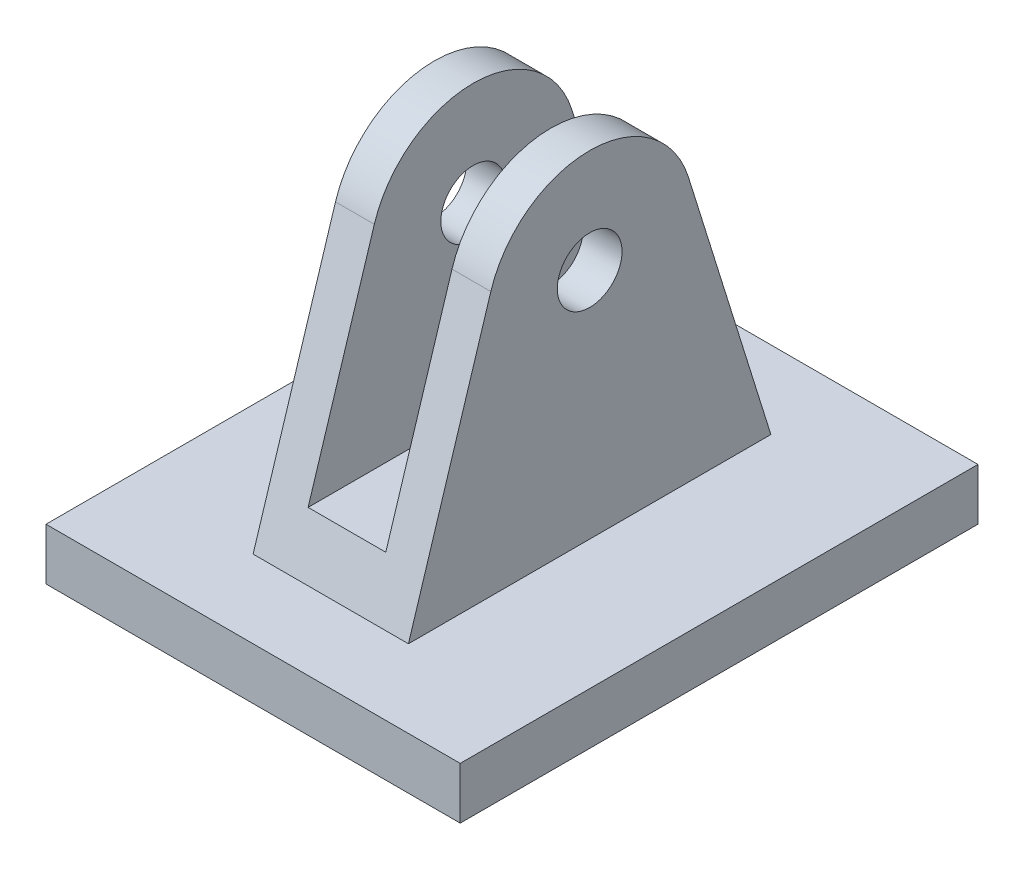
ISO-10303-21;
HEADER;
FILE_DESCRIPTION(('STEP AP214'),'2;1');
FILE_NAME('part.step','',(''),(''),'','','');
FILE_SCHEMA(('AUTOMOTIVE_DESIGN { 1 0 10303 214 1 1 1 1 }'));
ENDSEC;
DATA;
#1=APPLICATION_CONTEXT('core data for automotive mechanical design processes');
#2=APPLICATION_PROTOCOL_DEFINITION('international standard','automotive_design',2000,#1);
#3=PRODUCT_CONTEXT('',#1,'mechanical');
#4=PRODUCT('Part','Part','',(#3));
#5=PRODUCT_RELATED_PRODUCT_CATEGORY('part','',(#4));
#6=PRODUCT_DEFINITION_FORMATION('','',#4);
#7=PRODUCT_DEFINITION_CONTEXT('part definition',#1,'design');
#8=PRODUCT_DEFINITION('design','',#6,#7);
#9=PRODUCT_DEFINITION_SHAPE('','',#8);
#10=(LENGTH_UNIT() NAMED_UNIT(*) SI_UNIT(.MILLI.,.METRE.));
#11=(NAMED_UNIT(*) PLANE_ANGLE_UNIT() SI_UNIT($,.RADIAN.));
#12=(NAMED_UNIT(*) SI_UNIT($,.STERADIAN.) SOLID_ANGLE_UNIT());
#13=UNCERTAINTY_MEASURE_WITH_UNIT(LENGTH_MEASURE(1.E-05),#10,'distance_accuracy_value','');
#14=(GEOMETRIC_REPRESENTATION_CONTEXT(3) GLOBAL_UNCERTAINTY_ASSIGNED_CONTEXT((#13)) GLOBAL_UNIT_ASSIGNED_CONTEXT((#10,
#11,#12)) REPRESENTATION_CONTEXT('',''));
#15=CARTESIAN_POINT('',(0.,0.,0.));
#16=DIRECTION('',(0.,0.,1.));
#17=DIRECTION('',(1.,0.,0.));
#18=AXIS2_PLACEMENT_3D('',#15,#16,#17);
#19=CARTESIAN_POINT('',(15.,55.,0.));
#20=DIRECTION('',(-1.,0.,0.));
#21=DIRECTION('',(0.,0.,1.));
#22=AXIS2_PLACEMENT_3D('',#19,#20,#21);
#23=CYLINDRICAL_SURFACE('',#22,20.);
#24=DIRECTION('',(-1.,0.,0.));
#25=VECTOR('',#24,1.);
#26=CARTESIAN_POINT('',(15.,60.9599304252645,19.0913391181972));
#27=LINE('',#26,#25);
#28=CARTESIAN_POINT('',(-7.5,60.9599304252645,19.0913391181972));
#29=VERTEX_POINT('',#28);
#30=CARTESIAN_POINT('',(-15.,60.9599304252645,19.0913391181972));
#31=VERTEX_POINT('',#30);
#32=EDGE_CURVE('E202',#29,#31,#27,.T.);
#33=ORIENTED_EDGE('',*,*,#32,.F.);
#34=CARTESIAN_POINT('',(-7.5,55.,0.));
#35=DIRECTION('',(-1.,0.,0.));
#36=DIRECTION('',(0.,0.,1.));
#37=AXIS2_PLACEMENT_3D('',#34,#35,#36);
#38=CIRCLE('',#37,20.);
#39=CARTESIAN_POINT('',(-7.5,60.9599304252645,-19.0913391181972));
#40=VERTEX_POINT('',#39);
#41=EDGE_CURVE('E165',#29,#40,#38,.T.);
#42=ORIENTED_EDGE('',*,*,#41,.T.);
#43=DIRECTION('',(-1.,0.,0.));
#44=VECTOR('',#43,1.);
#45=CARTESIAN_POINT('',(15.,60.9599304252645,-19.0913391181972));
#46=LINE('',#45,#44);
#47=CARTESIAN_POINT('',(-15.,60.9599304252645,-19.0913391181972));
#48=VERTEX_POINT('',#47);
#49=EDGE_CURVE('E207',#40,#48,#46,.T.);
#50=ORIENTED_EDGE('',*,*,#49,.T.);
#51=CARTESIAN_POINT('',(-15.,55.,0.));
#52=DIRECTION('',(1.,0.,0.));
#53=DIRECTION('',(0.,0.,1.));
#54=AXIS2_PLACEMENT_3D('',#51,#52,#53);
#55=CIRCLE('',#54,20.);
#56=EDGE_CURVE('E193',#48,#31,#55,.T.);
#57=ORIENTED_EDGE('',*,*,#56,.T.);
#58=EDGE_LOOP('',(#33,#42,#50,#57));
#59=FACE_BOUND('',#58,.T.);
#60=ADVANCED_FACE('F43',(#59),#23,.T.);
#61=CARTESIAN_POINT('',(15.,55.,0.));
#62=DIRECTION('',(-1.,0.,0.));
#63=DIRECTION('',(0.,0.,1.));
#64=AXIS2_PLACEMENT_3D('',#61,#62,#63);
#65=CYLINDRICAL_SURFACE('',#64,6.25);
#66=CARTESIAN_POINT('',(-7.5,55.,0.));
#67=DIRECTION('',(-1.,0.,0.));
#68=DIRECTION('',(0.,0.,1.));
#69=AXIS2_PLACEMENT_3D('',#66,#67,#68);
#70=CIRCLE('',#69,6.25);
#71=CARTESIAN_POINT('',(-7.5,55.,6.25000000000001));
#72=VERTEX_POINT('',#71);
#73=EDGE_CURVE('E146',#72,#72,#70,.T.);
#74=ORIENTED_EDGE('',*,*,#73,.F.);
#75=EDGE_LOOP('',(#74));
#76=FACE_BOUND('',#75,.T.);
#77=CARTESIAN_POINT('',(-15.,55.,0.));
#78=DIRECTION('',(1.,0.,0.));
#79=DIRECTION('',(0.,0.,-1.));
#80=AXIS2_PLACEMENT_3D('',#77,#78,#79);
#81=CIRCLE('',#80,6.25);
#82=CARTESIAN_POINT('',(-15.,55.,-6.24999999999999));
#83=VERTEX_POINT('',#82);
#84=EDGE_CURVE('E158',#83,#83,#81,.T.);
#85=ORIENTED_EDGE('',*,*,#84,.F.);
#86=EDGE_LOOP('',(#85));
#87=FACE_BOUND('',#86,.T.);
#88=ADVANCED_FACE('F311',(#76,#87),#65,.F.);
#89=CARTESIAN_POINT('',(0.,10.,0.));
#90=DIRECTION('',(0.,1.,0.));
#91=DIRECTION('',(0.,0.,1.));
#92=AXIS2_PLACEMENT_3D('',#89,#90,#91);
#93=PLANE('',#92);
#94=DIRECTION('',(0.,0.,1.));
#95=VECTOR('',#94,1.);
#96=CARTESIAN_POINT('',(-40.,10.,-50.));
#97=LINE('',#96,#95);
#98=CARTESIAN_POINT('',(-40.,10.,-50.));
#99=VERTEX_POINT('',#98);
#100=CARTESIAN_POINT('',(-40.,10.,50.));
#101=VERTEX_POINT('',#100);
#102=EDGE_CURVE('E216',#99,#101,#97,.T.);
#103=ORIENTED_EDGE('',*,*,#102,.T.);
#104=DIRECTION('',(1.,0.,0.));
#105=VECTOR('',#104,1.);
#106=CARTESIAN_POINT('',(-40.,10.,50.));
#107=LINE('',#106,#105);
#108=CARTESIAN_POINT('',(40.,10.,50.));
#109=VERTEX_POINT('',#108);
#110=EDGE_CURVE('E220',#101,#109,#107,.T.);
#111=ORIENTED_EDGE('',*,*,#110,.T.);
#112=DIRECTION('',(0.,0.,-1.));
#113=VECTOR('',#112,1.);
#114=CARTESIAN_POINT('',(40.,10.,-50.));
#115=LINE('',#114,#113);
#116=CARTESIAN_POINT('',(40.,10.,-50.));
#117=VERTEX_POINT('',#116);
#118=EDGE_CURVE('E224',#109,#117,#115,.T.);
#119=ORIENTED_EDGE('',*,*,#118,.T.);
#120=DIRECTION('',(-1.,0.,0.));
#121=VECTOR('',#120,1.);
#122=CARTESIAN_POINT('',(-40.,10.,-50.));
#123=LINE('',#122,#121);
#124=EDGE_CURVE('E227',#117,#99,#123,.T.);
#125=ORIENTED_EDGE('',*,*,#124,.T.);
#126=EDGE_LOOP('',(#103,#111,#119,#125));
#127=FACE_BOUND('',#126,.T.);
#128=DIRECTION('',(-1.,0.,0.));
#129=VECTOR('',#128,1.);
#130=CARTESIAN_POINT('',(15.,10.,35.));
#131=LINE('',#130,#129);
#132=CARTESIAN_POINT('',(15.,10.,35.));
#133=VERTEX_POINT('',#132);
#134=CARTESIAN_POINT('',(-15.,10.,35.));
#135=VERTEX_POINT('',#134);
#136=EDGE_CURVE('E186',#133,#135,#131,.T.);
#137=ORIENTED_EDGE('',*,*,#136,.T.);
#138=DIRECTION('',(0.,0.,-1.));
#139=VECTOR('',#138,1.);
#140=CARTESIAN_POINT('',(-15.,10.,35.));
#141=LINE('',#140,#139);
#142=CARTESIAN_POINT('',(-15.,10.,-35.));
#143=VERTEX_POINT('',#142);
#144=EDGE_CURVE('E67',#135,#143,#141,.T.);
#145=ORIENTED_EDGE('',*,*,#144,.T.);
#146=DIRECTION('',(-1.,0.,0.));
#147=VECTOR('',#146,1.);
#148=CARTESIAN_POINT('',(15.,10.,-35.));
#149=LINE('',#148,#147);
#150=CARTESIAN_POINT('',(15.,10.,-35.));
#151=VERTEX_POINT('',#150);
#152=EDGE_CURVE('E211',#151,#143,#149,.T.);
#153=ORIENTED_EDGE('',*,*,#152,.F.);
#154=DIRECTION('',(0.,0.,-1.));
#155=VECTOR('',#154,1.);
#156=CARTESIAN_POINT('',(15.,10.,35.));
#157=LINE('',#156,#155);
#158=EDGE_CURVE('E172',#133,#151,#157,.T.);
#159=ORIENTED_EDGE('',*,*,#158,.F.);
#160=EDGE_LOOP('',(#137,#145,#153,#159));
#161=FACE_BOUND('',#160,.T.);
#162=ADVANCED_FACE('F290',(#127,#161),#93,.T.);
#163=CARTESIAN_POINT('',(-40.,10.,-50.));
#164=DIRECTION('',(1.,0.,0.));
#165=DIRECTION('',(0.,0.,-1.));
#166=AXIS2_PLACEMENT_3D('',#163,#164,#165);
#167=PLANE('',#166);
#168=DIRECTION('',(0.,0.,1.));
#169=VECTOR('',#168,1.);
#170=CARTESIAN_POINT('',(-40.,0.,-50.));
#171=LINE('',#170,#169);
#172=CARTESIAN_POINT('',(-40.,0.,-50.));
#173=VERTEX_POINT('',#172);
#174=CARTESIAN_POINT('',(-40.,0.,50.));
#175=VERTEX_POINT('',#174);
#176=EDGE_CURVE('E215',#173,#175,#171,.T.);
#177=ORIENTED_EDGE('',*,*,#176,.T.);
#178=DIRECTION('',(0.,-1.,0.));
#179=VECTOR('',#178,1.);
#180=CARTESIAN_POINT('',(-40.,10.,50.));
#181=LINE('',#180,#179);
#182=EDGE_CURVE('E52',#101,#175,#181,.T.);
#183=ORIENTED_EDGE('',*,*,#182,.F.);
#184=ORIENTED_EDGE('',*,*,#102,.F.);
#185=DIRECTION('',(0.,-1.,0.));
#186=VECTOR('',#185,1.);
#187=CARTESIAN_POINT('',(-40.,10.,-50.));
#188=LINE('',#187,#186);
#189=EDGE_CURVE('E230',#99,#173,#188,.T.);
#190=ORIENTED_EDGE('',*,*,#189,.T.);
#191=EDGE_LOOP('',(#177,#183,#184,#190));
#192=FACE_BOUND('',#191,.T.);
#193=ADVANCED_FACE('F45',(#192),#167,.F.);
#194=CARTESIAN_POINT('',(-40.,10.,50.));
#195=DIRECTION('',(0.,0.,-1.));
#196=DIRECTION('',(-1.,0.,0.));
#197=AXIS2_PLACEMENT_3D('',#194,#195,#196);
#198=PLANE('',#197);
#199=DIRECTION('',(1.,0.,0.));
#200=VECTOR('',#199,1.);
#201=CARTESIAN_POINT('',(-40.,0.,50.));
#202=LINE('',#201,#200);
#203=CARTESIAN_POINT('',(40.,0.,50.));
#204=VERTEX_POINT('',#203);
#205=EDGE_CURVE('E234',#175,#204,#202,.T.);
#206=ORIENTED_EDGE('',*,*,#205,.T.);
#207=DIRECTION('',(0.,-1.,0.));
#208=VECTOR('',#207,1.);
#209=CARTESIAN_POINT('',(40.,10.,50.));
#210=LINE('',#209,#208);
#211=EDGE_CURVE('E249',#109,#204,#210,.T.);
#212=ORIENTED_EDGE('',*,*,#211,.F.);
#213=ORIENTED_EDGE('',*,*,#110,.F.);
#214=ORIENTED_EDGE('',*,*,#182,.T.);
#215=EDGE_LOOP('',(#206,#212,#213,#214));
#216=FACE_BOUND('',#215,.T.);
#217=ADVANCED_FACE('F342',(#216),#198,.F.);
#218=CARTESIAN_POINT('',(40.,10.,-50.));
#219=DIRECTION('',(-1.,0.,0.));
#220=DIRECTION('',(0.,0.,1.));
#221=AXIS2_PLACEMENT_3D('',#218,#219,#220);
#222=PLANE('',#221);
#223=DIRECTION('',(0.,0.,-1.));
#224=VECTOR('',#223,1.);
#225=CARTESIAN_POINT('',(40.,0.,-50.));
#226=LINE('',#225,#224);
#227=CARTESIAN_POINT('',(40.,0.,-50.));
#228=VERTEX_POINT('',#227);
#229=EDGE_CURVE('E237',#204,#228,#226,.T.);
#230=ORIENTED_EDGE('',*,*,#229,.T.);
#231=DIRECTION('',(0.,-1.,0.));
#232=VECTOR('',#231,1.);
#233=CARTESIAN_POINT('',(40.,10.,-50.));
#234=LINE('',#233,#232);
#235=EDGE_CURVE('E245',#117,#228,#234,.T.);
#236=ORIENTED_EDGE('',*,*,#235,.F.);
#237=ORIENTED_EDGE('',*,*,#118,.F.);
#238=ORIENTED_EDGE('',*,*,#211,.T.);
#239=EDGE_LOOP('',(#230,#236,#237,#238));
#240=FACE_BOUND('',#239,.T.);
#241=ADVANCED_FACE('F339',(#240),#222,.F.);
#242=CARTESIAN_POINT('',(-40.,10.,-50.));
#243=DIRECTION('',(0.,0.,1.));
#244=DIRECTION('',(1.,0.,0.));
#245=AXIS2_PLACEMENT_3D('',#242,#243,#244);
#246=PLANE('',#245);
#247=DIRECTION('',(-1.,0.,0.));
#248=VECTOR('',#247,1.);
#249=CARTESIAN_POINT('',(-40.,0.,-50.));
#250=LINE('',#249,#248);
#251=EDGE_CURVE('E221',#228,#173,#250,.T.);
#252=ORIENTED_EDGE('',*,*,#251,.T.);
#253=ORIENTED_EDGE('',*,*,#189,.F.);
#254=ORIENTED_EDGE('',*,*,#124,.F.);
#255=ORIENTED_EDGE('',*,*,#235,.T.);
#256=EDGE_LOOP('',(#252,#253,#254,#255));
#257=FACE_BOUND('',#256,.T.);
#258=ADVANCED_FACE('F335',(#257),#246,.F.);
#259=CARTESIAN_POINT('',(0.,0.,0.));
#260=DIRECTION('',(0.,1.,0.));
#261=DIRECTION('',(0.,0.,1.));
#262=AXIS2_PLACEMENT_3D('',#259,#260,#261);
#263=PLANE('',#262);
#264=ORIENTED_EDGE('',*,*,#176,.F.);
#265=ORIENTED_EDGE('',*,*,#251,.F.);
#266=ORIENTED_EDGE('',*,*,#229,.F.);
#267=ORIENTED_EDGE('',*,*,#205,.F.);
#268=EDGE_LOOP('',(#264,#265,#266,#267));
#269=FACE_BOUND('',#268,.T.);
#270=ADVANCED_FACE('F332',(#269),#263,.F.);
#271=CARTESIAN_POINT('',(15.,55.,0.));
#272=DIRECTION('',(-1.,0.,0.));
#273=DIRECTION('',(0.,0.,1.));
#274=AXIS2_PLACEMENT_3D('',#271,#272,#273);
#275=PLANE('',#274);
#276=ORIENTED_EDGE('',*,*,#158,.T.);
#277=DIRECTION('',(0.,0.95456695590986,0.297996521263225));
#278=VECTOR('',#277,1.);
#279=CARTESIAN_POINT('',(15.,10.,-35.));
#280=LINE('',#279,#278);
#281=CARTESIAN_POINT('',(15.,60.9599304252645,-19.0913391181972));
#282=VERTEX_POINT('',#281);
#283=EDGE_CURVE('E176',#151,#282,#280,.T.);
#284=ORIENTED_EDGE('',*,*,#283,.T.);
#285=CARTESIAN_POINT('',(15.,55.,0.));
#286=DIRECTION('',(1.,0.,0.));
#287=DIRECTION('',(0.,0.,1.));
#288=AXIS2_PLACEMENT_3D('',#285,#286,#287);
#289=CIRCLE('',#288,20.);
#290=CARTESIAN_POINT('',(15.,60.9599304252645,19.0913391181972));
#291=VERTEX_POINT('',#290);
#292=EDGE_CURVE('E180',#282,#291,#289,.T.);
#293=ORIENTED_EDGE('',*,*,#292,.T.);
#294=DIRECTION('',(0.,-0.95456695590986,0.297996521263224));
#295=VECTOR('',#294,1.);
#296=CARTESIAN_POINT('',(15.,10.,35.));
#297=LINE('',#296,#295);
#298=EDGE_CURVE('E183',#291,#133,#297,.T.);
#299=ORIENTED_EDGE('',*,*,#298,.T.);
#300=EDGE_LOOP('',(#276,#284,#293,#299));
#301=FACE_BOUND('',#300,.T.);
#302=CARTESIAN_POINT('',(15.,55.,0.));
#303=DIRECTION('',(1.,0.,0.));
#304=DIRECTION('',(0.,0.,-1.));
#305=AXIS2_PLACEMENT_3D('',#302,#303,#304);
#306=CIRCLE('',#305,6.25);
#307=CARTESIAN_POINT('',(15.,55.,-6.24999999999999));
#308=VERTEX_POINT('',#307);
#309=EDGE_CURVE('E163',#308,#308,#306,.T.);
#310=ORIENTED_EDGE('',*,*,#309,.F.);
#311=EDGE_LOOP('',(#310));
#312=FACE_BOUND('',#311,.T.);
#313=ADVANCED_FACE('F287',(#301,#312),#275,.F.);
#314=CARTESIAN_POINT('',(-15.,55.,0.));
#315=DIRECTION('',(-1.,0.,0.));
#316=DIRECTION('',(0.,0.,1.));
#317=AXIS2_PLACEMENT_3D('',#314,#315,#316);
#318=PLANE('',#317);
#319=ORIENTED_EDGE('',*,*,#144,.F.);
#320=DIRECTION('',(0.,-0.95456695590986,0.297996521263224));
#321=VECTOR('',#320,1.);
#322=CARTESIAN_POINT('',(-15.,10.,35.));
#323=LINE('',#322,#321);
#324=EDGE_CURVE('E177',#31,#135,#323,.T.);
#325=ORIENTED_EDGE('',*,*,#324,.F.);
#326=ORIENTED_EDGE('',*,*,#56,.F.);
#327=DIRECTION('',(0.,0.95456695590986,0.297996521263225));
#328=VECTOR('',#327,1.);
#329=CARTESIAN_POINT('',(-15.,10.,-35.));
#330=LINE('',#329,#328);
#331=EDGE_CURVE('E189',#143,#48,#330,.T.);
#332=ORIENTED_EDGE('',*,*,#331,.F.);
#333=EDGE_LOOP('',(#319,#325,#326,#332));
#334=FACE_BOUND('',#333,.T.);
#335=ORIENTED_EDGE('',*,*,#84,.T.);
#336=EDGE_LOOP('',(#335));
#337=FACE_BOUND('',#336,.T.);
#338=ADVANCED_FACE('F292',(#334,#337),#318,.T.);
#339=CARTESIAN_POINT('',(15.,10.,-35.));
#340=DIRECTION('',(0.,-0.297996521263225,0.95456695590986));
#341=DIRECTION('',(0.,-0.95456695590986,-0.297996521263225));
#342=AXIS2_PLACEMENT_3D('',#339,#340,#341);
#343=PLANE('',#342);
#344=ORIENTED_EDGE('',*,*,#49,.F.);
#345=DIRECTION('',(0.,-0.95456695590986,-0.297996521263225));
#346=VECTOR('',#345,1.);
#347=CARTESIAN_POINT('',(-7.5,10.,-35.));
#348=LINE('',#347,#346);
#349=CARTESIAN_POINT('',(-7.5,20.,-31.87820200125));
#350=VERTEX_POINT('',#349);
#351=EDGE_CURVE('E156',#40,#350,#348,.T.);
#352=ORIENTED_EDGE('',*,*,#351,.T.);
#353=DIRECTION('',(1.,0.,0.));
#354=VECTOR('',#353,1.);
#355=CARTESIAN_POINT('',(15.,20.,-31.87820200125));
#356=LINE('',#355,#354);
#357=CARTESIAN_POINT('',(7.5,20.,-31.87820200125));
#358=VERTEX_POINT('',#357);
#359=EDGE_CURVE('E149',#350,#358,#356,.T.);
#360=ORIENTED_EDGE('',*,*,#359,.T.);
#361=DIRECTION('',(0.,0.95456695590986,0.297996521263225));
#362=VECTOR('',#361,1.);
#363=CARTESIAN_POINT('',(7.5,10.,-35.));
#364=LINE('',#363,#362);
#365=CARTESIAN_POINT('',(7.5,60.9599304252645,-19.0913391181972));
#366=VERTEX_POINT('',#365);
#367=EDGE_CURVE('E134',#358,#366,#364,.T.);
#368=ORIENTED_EDGE('',*,*,#367,.T.);
#369=EDGE_CURVE('E208',#282,#366,#46,.T.);
#370=ORIENTED_EDGE('',*,*,#369,.F.);
#371=ORIENTED_EDGE('',*,*,#283,.F.);
#372=ORIENTED_EDGE('',*,*,#152,.T.);
#373=ORIENTED_EDGE('',*,*,#331,.T.);
#374=EDGE_LOOP('',(#344,#352,#360,#368,#370,#371,#372,#373));
#375=FACE_BOUND('',#374,.T.);
#376=ADVANCED_FACE('F155',(#375),#343,.F.);
#377=CARTESIAN_POINT('',(7.5,55.,0.));
#378=DIRECTION('',(1.,0.,0.));
#379=DIRECTION('',(0.,0.,-1.));
#380=AXIS2_PLACEMENT_3D('',#377,#378,#379);
#381=CIRCLE('',#380,20.);
#382=CARTESIAN_POINT('',(7.5,60.9599304252645,19.0913391181972));
#383=VERTEX_POINT('',#382);
#384=EDGE_CURVE('E140',#366,#383,#381,.T.);
#385=ORIENTED_EDGE('',*,*,#384,.T.);
#386=EDGE_CURVE('E203',#291,#383,#27,.T.);
#387=ORIENTED_EDGE('',*,*,#386,.F.);
#388=ORIENTED_EDGE('',*,*,#292,.F.);
#389=ORIENTED_EDGE('',*,*,#369,.T.);
#390=EDGE_LOOP('',(#385,#387,#388,#389));
#391=FACE_BOUND('',#390,.T.);
#392=ADVANCED_FACE('F283',(#391),#23,.T.);
#393=CARTESIAN_POINT('',(15.,10.,35.));
#394=DIRECTION('',(0.,-0.297996521263224,-0.95456695590986));
#395=DIRECTION('',(0.,0.95456695590986,-0.297996521263224));
#396=AXIS2_PLACEMENT_3D('',#393,#394,#395);
#397=PLANE('',#396);
#398=DIRECTION('',(-1.,0.,0.));
#399=VECTOR('',#398,1.);
#400=CARTESIAN_POINT('',(15.,20.,31.87820200125));
#401=LINE('',#400,#399);
#402=CARTESIAN_POINT('',(7.5,20.,31.87820200125));
#403=VERTEX_POINT('',#402);
#404=CARTESIAN_POINT('',(-7.5,20.,31.87820200125));
#405=VERTEX_POINT('',#404);
#406=EDGE_CURVE('E11',#403,#405,#401,.T.);
#407=ORIENTED_EDGE('',*,*,#406,.T.);
#408=DIRECTION('',(0.,0.95456695590986,-0.297996521263224));
#409=VECTOR('',#408,1.);
#410=CARTESIAN_POINT('',(-7.5,10.,35.));
#411=LINE('',#410,#409);
#412=EDGE_CURVE('E261',#405,#29,#411,.T.);
#413=ORIENTED_EDGE('',*,*,#412,.T.);
#414=ORIENTED_EDGE('',*,*,#32,.T.);
#415=ORIENTED_EDGE('',*,*,#324,.T.);
#416=ORIENTED_EDGE('',*,*,#136,.F.);
#417=ORIENTED_EDGE('',*,*,#298,.F.);
#418=ORIENTED_EDGE('',*,*,#386,.T.);
#419=DIRECTION('',(0.,-0.95456695590986,0.297996521263224));
#420=VECTOR('',#419,1.);
#421=CARTESIAN_POINT('',(7.5,10.,35.));
#422=LINE('',#421,#420);
#423=EDGE_CURVE('E258',#383,#403,#422,.T.);
#424=ORIENTED_EDGE('',*,*,#423,.T.);
#425=EDGE_LOOP('',(#407,#413,#414,#415,#416,#417,#418,#424));
#426=FACE_BOUND('',#425,.T.);
#427=ADVANCED_FACE('F277',(#426),#397,.F.);
#428=CARTESIAN_POINT('',(7.5,55.,0.));
#429=DIRECTION('',(1.,0.,0.));
#430=DIRECTION('',(0.,0.,-1.));
#431=AXIS2_PLACEMENT_3D('',#428,#429,#430);
#432=CIRCLE('',#431,6.25);
#433=CARTESIAN_POINT('',(7.5,55.,-6.24999999999999));
#434=VERTEX_POINT('',#433);
#435=EDGE_CURVE('E151',#434,#434,#432,.T.);
#436=ORIENTED_EDGE('',*,*,#435,.F.);
#437=EDGE_LOOP('',(#436));
#438=FACE_BOUND('',#437,.T.);
#439=ORIENTED_EDGE('',*,*,#309,.T.);
#440=EDGE_LOOP('',(#439));
#441=FACE_BOUND('',#440,.T.);
#442=ADVANCED_FACE('F307',(#438,#441),#65,.F.);
#443=CARTESIAN_POINT('',(-7.5,20.,-50.));
#444=DIRECTION('',(0.,-1.,0.));
#445=DIRECTION('',(0.,0.,-1.));
#446=AXIS2_PLACEMENT_3D('',#443,#444,#445);
#447=PLANE('',#446);
#448=DIRECTION('',(0.,0.,1.));
#449=VECTOR('',#448,1.);
#450=CARTESIAN_POINT('',(-7.5,20.,-50.));
#451=LINE('',#450,#449);
#452=EDGE_CURVE('E59',#350,#405,#451,.T.);
#453=ORIENTED_EDGE('',*,*,#452,.T.);
#454=ORIENTED_EDGE('',*,*,#406,.F.);
#455=DIRECTION('',(0.,0.,1.));
#456=VECTOR('',#455,1.);
#457=CARTESIAN_POINT('',(7.5,20.,-50.));
#458=LINE('',#457,#456);
#459=EDGE_CURVE('E138',#358,#403,#458,.T.);
#460=ORIENTED_EDGE('',*,*,#459,.F.);
#461=ORIENTED_EDGE('',*,*,#359,.F.);
#462=EDGE_LOOP('',(#453,#454,#460,#461));
#463=FACE_BOUND('',#462,.T.);
#464=ADVANCED_FACE('F148',(#463),#447,.F.);
#465=CARTESIAN_POINT('',(-7.5,20.,-50.));
#466=DIRECTION('',(-1.,0.,0.));
#467=DIRECTION('',(0.,0.,1.));
#468=AXIS2_PLACEMENT_3D('',#465,#466,#467);
#469=PLANE('',#468);
#470=ORIENTED_EDGE('',*,*,#73,.T.);
#471=EDGE_LOOP('',(#470));
#472=FACE_BOUND('',#471,.T.);
#473=ORIENTED_EDGE('',*,*,#41,.F.);
#474=ORIENTED_EDGE('',*,*,#412,.F.);
#475=ORIENTED_EDGE('',*,*,#452,.F.);
#476=ORIENTED_EDGE('',*,*,#351,.F.);
#477=EDGE_LOOP('',(#473,#474,#475,#476));
#478=FACE_BOUND('',#477,.T.);
#479=ADVANCED_FACE('F298',(#472,#478),#469,.F.);
#480=CARTESIAN_POINT('',(7.5,20.,-50.));
#481=DIRECTION('',(1.,0.,0.));
#482=DIRECTION('',(0.,0.,-1.));
#483=AXIS2_PLACEMENT_3D('',#480,#481,#482);
#484=PLANE('',#483);
#485=ORIENTED_EDGE('',*,*,#435,.T.);
#486=EDGE_LOOP('',(#485));
#487=FACE_BOUND('',#486,.T.);
#488=ORIENTED_EDGE('',*,*,#459,.T.);
#489=ORIENTED_EDGE('',*,*,#423,.F.);
#490=ORIENTED_EDGE('',*,*,#384,.F.);
#491=ORIENTED_EDGE('',*,*,#367,.F.);
#492=EDGE_LOOP('',(#488,#489,#490,#491));
#493=FACE_BOUND('',#492,.T.);
#494=ADVANCED_FACE('F136',(#487,#493),#484,.F.);
#495=CLOSED_SHELL('',(#60,#88,#162,#193,#217,#241,#258,#270,#313,#338,#376,#392,#427,#442,#464,
#479,#494));
#496=MANIFOLD_SOLID_BREP('B2',#495);
#497=ADVANCED_BREP_SHAPE_REPRESENTATION('',(#18,#496),#14);
#498=SHAPE_DEFINITION_REPRESENTATION(#9,#497);
ENDSEC;
END-ISO-10303-21;
